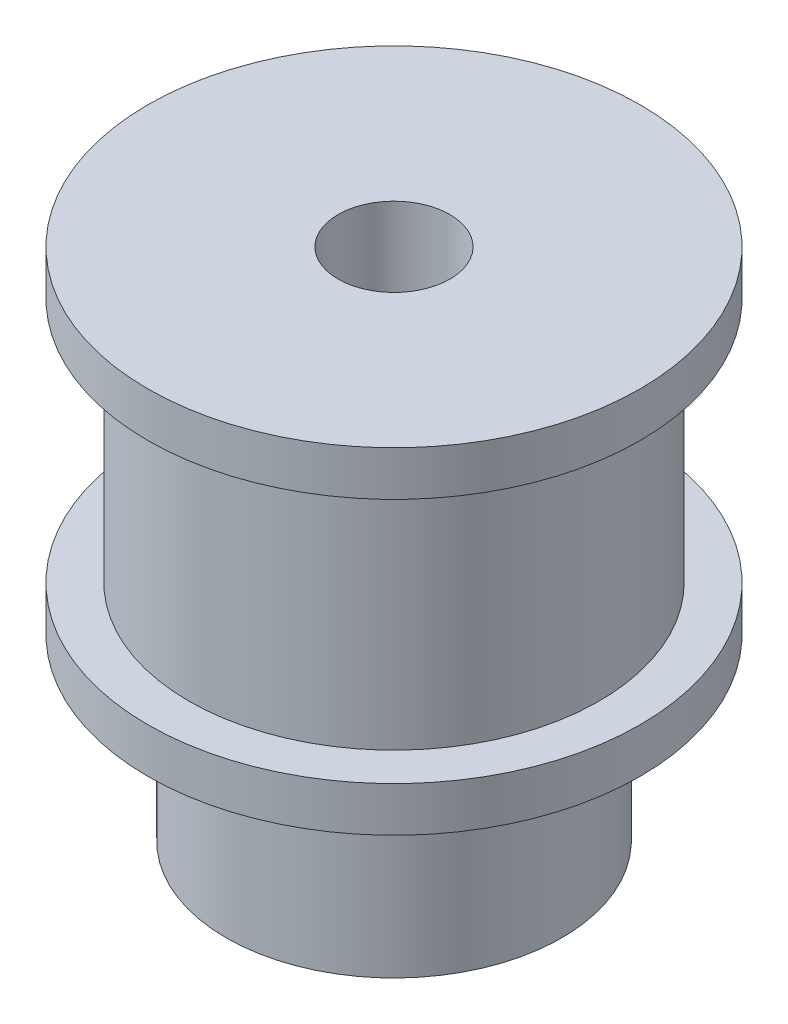
ISO-10303-21;
HEADER;
FILE_DESCRIPTION(('STEP AP214'),'2;1');
FILE_NAME('part.step','',(''),(''),'','','');
FILE_SCHEMA(('AUTOMOTIVE_DESIGN { 1 0 10303 214 1 1 1 1 }'));
ENDSEC;
DATA;
#1=APPLICATION_CONTEXT('core data for automotive mechanical design processes');
#2=APPLICATION_PROTOCOL_DEFINITION('international standard','automotive_design',2000,#1);
#3=PRODUCT_CONTEXT('',#1,'mechanical');
#4=PRODUCT('Part','Part','',(#3));
#5=PRODUCT_RELATED_PRODUCT_CATEGORY('part','',(#4));
#6=PRODUCT_DEFINITION_FORMATION('','',#4);
#7=PRODUCT_DEFINITION_CONTEXT('part definition',#1,'design');
#8=PRODUCT_DEFINITION('design','',#6,#7);
#9=PRODUCT_DEFINITION_SHAPE('','',#8);
#10=(LENGTH_UNIT() NAMED_UNIT(*) SI_UNIT(.MILLI.,.METRE.));
#11=(NAMED_UNIT(*) PLANE_ANGLE_UNIT() SI_UNIT($,.RADIAN.));
#12=(NAMED_UNIT(*) SI_UNIT($,.STERADIAN.) SOLID_ANGLE_UNIT());
#13=UNCERTAINTY_MEASURE_WITH_UNIT(LENGTH_MEASURE(1.E-05),#10,'distance_accuracy_value','');
#14=(GEOMETRIC_REPRESENTATION_CONTEXT(3) GLOBAL_UNCERTAINTY_ASSIGNED_CONTEXT((#13)) GLOBAL_UNIT_ASSIGNED_CONTEXT((#10,
#11,#12)) REPRESENTATION_CONTEXT('',''));
#15=CARTESIAN_POINT('',(0.,0.,0.));
#16=DIRECTION('',(0.,0.,1.));
#17=DIRECTION('',(1.,0.,0.));
#18=AXIS2_PLACEMENT_3D('',#15,#16,#17);
#19=CARTESIAN_POINT('',(0.,2.,0.));
#20=DIRECTION('',(0.,-1.,0.));
#21=DIRECTION('',(0.,0.,-1.));
#22=AXIS2_PLACEMENT_3D('',#19,#20,#21);
#23=CYLINDRICAL_SURFACE('',#22,11.);
#24=CARTESIAN_POINT('',(0.,2.,0.));
#25=DIRECTION('',(0.,1.,0.));
#26=DIRECTION('',(0.,0.,1.));
#27=AXIS2_PLACEMENT_3D('',#24,#25,#26);
#28=CIRCLE('',#27,11.);
#29=CARTESIAN_POINT('',(0.,2.,11.));
#30=VERTEX_POINT('',#29);
#31=EDGE_CURVE('E55',#30,#30,#28,.T.);
#32=ORIENTED_EDGE('',*,*,#31,.F.);
#33=EDGE_LOOP('',(#32));
#34=FACE_BOUND('',#33,.T.);
#35=CARTESIAN_POINT('',(0.,0.,0.));
#36=DIRECTION('',(0.,1.,0.));
#37=DIRECTION('',(0.,0.,1.));
#38=AXIS2_PLACEMENT_3D('',#35,#36,#37);
#39=CIRCLE('',#38,11.);
#40=CARTESIAN_POINT('',(0.,0.,11.));
#41=VERTEX_POINT('',#40);
#42=EDGE_CURVE('E44',#41,#41,#39,.T.);
#43=ORIENTED_EDGE('',*,*,#42,.T.);
#44=EDGE_LOOP('',(#43));
#45=FACE_BOUND('',#44,.T.);
#46=ADVANCED_FACE('F41',(#34,#45),#23,.T.);
#47=CARTESIAN_POINT('',(0.,2.,0.));
#48=DIRECTION('',(0.,1.,0.));
#49=DIRECTION('',(0.,0.,1.));
#50=AXIS2_PLACEMENT_3D('',#47,#48,#49);
#51=PLANE('',#50);
#52=CARTESIAN_POINT('',(0.,2.,0.));
#53=DIRECTION('',(0.,1.,0.));
#54=DIRECTION('',(0.,0.,1.));
#55=AXIS2_PLACEMENT_3D('',#52,#53,#54);
#56=CIRCLE('',#55,9.17);
#57=CARTESIAN_POINT('',(0.,2.,9.17));
#58=VERTEX_POINT('',#57);
#59=EDGE_CURVE('E49',#58,#58,#56,.T.);
#60=ORIENTED_EDGE('',*,*,#59,.F.);
#61=EDGE_LOOP('',(#60));
#62=FACE_BOUND('',#61,.T.);
#63=ORIENTED_EDGE('',*,*,#31,.T.);
#64=EDGE_LOOP('',(#63));
#65=FACE_BOUND('',#64,.T.);
#66=ADVANCED_FACE('F88',(#62,#65),#51,.T.);
#67=CARTESIAN_POINT('',(0.,0.,0.));
#68=DIRECTION('',(0.,1.,0.));
#69=DIRECTION('',(0.,0.,1.));
#70=AXIS2_PLACEMENT_3D('',#67,#68,#69);
#71=PLANE('',#70);
#72=CARTESIAN_POINT('',(0.,0.,0.));
#73=DIRECTION('',(0.,-1.,0.));
#74=DIRECTION('',(0.,0.,-1.));
#75=AXIS2_PLACEMENT_3D('',#72,#73,#74);
#76=CIRCLE('',#75,7.5);
#77=CARTESIAN_POINT('',(0.,0.,-7.5));
#78=VERTEX_POINT('',#77);
#79=EDGE_CURVE('E10',#78,#78,#76,.T.);
#80=ORIENTED_EDGE('',*,*,#79,.F.);
#81=EDGE_LOOP('',(#80));
#82=FACE_BOUND('',#81,.T.);
#83=ORIENTED_EDGE('',*,*,#42,.F.);
#84=EDGE_LOOP('',(#83));
#85=FACE_BOUND('',#84,.T.);
#86=ADVANCED_FACE('F85',(#82,#85),#71,.F.);
#87=CARTESIAN_POINT('',(0.,13.,0.));
#88=DIRECTION('',(0.,-1.,0.));
#89=DIRECTION('',(0.,0.,-1.));
#90=AXIS2_PLACEMENT_3D('',#87,#88,#89);
#91=CYLINDRICAL_SURFACE('',#90,9.17);
#92=CARTESIAN_POINT('',(0.,13.,0.));
#93=DIRECTION('',(0.,1.,0.));
#94=DIRECTION('',(0.,0.,1.));
#95=AXIS2_PLACEMENT_3D('',#92,#93,#94);
#96=CIRCLE('',#95,9.17);
#97=CARTESIAN_POINT('',(0.,13.,9.17));
#98=VERTEX_POINT('',#97);
#99=EDGE_CURVE('E70',#98,#98,#96,.T.);
#100=ORIENTED_EDGE('',*,*,#99,.F.);
#101=EDGE_LOOP('',(#100));
#102=FACE_BOUND('',#101,.T.);
#103=ORIENTED_EDGE('',*,*,#59,.T.);
#104=EDGE_LOOP('',(#103));
#105=FACE_BOUND('',#104,.T.);
#106=ADVANCED_FACE('F87',(#102,#105),#91,.T.);
#107=CARTESIAN_POINT('',(0.,15.,0.));
#108=DIRECTION('',(0.,-1.,0.));
#109=DIRECTION('',(0.,0.,-1.));
#110=AXIS2_PLACEMENT_3D('',#107,#108,#109);
#111=CYLINDRICAL_SURFACE('',#110,11.);
#112=CARTESIAN_POINT('',(0.,15.,0.));
#113=DIRECTION('',(0.,1.,0.));
#114=DIRECTION('',(0.,0.,1.));
#115=AXIS2_PLACEMENT_3D('',#112,#113,#114);
#116=CIRCLE('',#115,11.);
#117=CARTESIAN_POINT('',(0.,15.,11.));
#118=VERTEX_POINT('',#117);
#119=EDGE_CURVE('E66',#118,#118,#116,.T.);
#120=ORIENTED_EDGE('',*,*,#119,.F.);
#121=EDGE_LOOP('',(#120));
#122=FACE_BOUND('',#121,.T.);
#123=CARTESIAN_POINT('',(0.,13.,0.));
#124=DIRECTION('',(0.,1.,0.));
#125=DIRECTION('',(0.,0.,1.));
#126=AXIS2_PLACEMENT_3D('',#123,#124,#125);
#127=CIRCLE('',#126,11.);
#128=CARTESIAN_POINT('',(0.,13.,11.));
#129=VERTEX_POINT('',#128);
#130=EDGE_CURVE('E65',#129,#129,#127,.T.);
#131=ORIENTED_EDGE('',*,*,#130,.T.);
#132=EDGE_LOOP('',(#131));
#133=FACE_BOUND('',#132,.T.);
#134=ADVANCED_FACE('F94',(#122,#133),#111,.T.);
#135=CARTESIAN_POINT('',(0.,15.,0.));
#136=DIRECTION('',(0.,1.,0.));
#137=DIRECTION('',(0.,0.,1.));
#138=AXIS2_PLACEMENT_3D('',#135,#136,#137);
#139=PLANE('',#138);
#140=CARTESIAN_POINT('',(0.,15.,0.));
#141=DIRECTION('',(0.,1.,0.));
#142=DIRECTION('',(0.,0.,1.));
#143=AXIS2_PLACEMENT_3D('',#140,#141,#142);
#144=CIRCLE('',#143,2.5);
#145=CARTESIAN_POINT('',(0.,15.,2.5));
#146=VERTEX_POINT('',#145);
#147=EDGE_CURVE('E61',#146,#146,#144,.T.);
#148=ORIENTED_EDGE('',*,*,#147,.F.);
#149=EDGE_LOOP('',(#148));
#150=FACE_BOUND('',#149,.T.);
#151=ORIENTED_EDGE('',*,*,#119,.T.);
#152=EDGE_LOOP('',(#151));
#153=FACE_BOUND('',#152,.T.);
#154=ADVANCED_FACE('F125',(#150,#153),#139,.T.);
#155=CARTESIAN_POINT('',(0.,13.,0.));
#156=DIRECTION('',(0.,1.,0.));
#157=DIRECTION('',(0.,0.,1.));
#158=AXIS2_PLACEMENT_3D('',#155,#156,#157);
#159=PLANE('',#158);
#160=ORIENTED_EDGE('',*,*,#99,.T.);
#161=EDGE_LOOP('',(#160));
#162=FACE_BOUND('',#161,.T.);
#163=ORIENTED_EDGE('',*,*,#130,.F.);
#164=EDGE_LOOP('',(#163));
#165=FACE_BOUND('',#164,.T.);
#166=ADVANCED_FACE('F134',(#162,#165),#159,.F.);
#167=CARTESIAN_POINT('',(0.,-11.,0.));
#168=DIRECTION('',(0.,1.,0.));
#169=DIRECTION('',(0.,0.,1.));
#170=AXIS2_PLACEMENT_3D('',#167,#168,#169);
#171=CYLINDRICAL_SURFACE('',#170,2.5);
#172=CARTESIAN_POINT('',(0.,-8.,0.));
#173=DIRECTION('',(0.,-1.,0.));
#174=DIRECTION('',(0.,0.,-1.));
#175=AXIS2_PLACEMENT_3D('',#172,#173,#174);
#176=CIRCLE('',#175,2.5);
#177=CARTESIAN_POINT('',(0.,-8.,2.5));
#178=VERTEX_POINT('',#177);
#179=EDGE_CURVE('E208',#178,#178,#176,.T.);
#180=CARTESIAN_POINT('',(0.,15.,2.5));
#181=CARTESIAN_POINT('',(0.,14.7604166666667,2.5));
#182=CARTESIAN_POINT('',(0.,14.5208333333333,2.5));
#183=CARTESIAN_POINT('',(0.,14.0416666666667,2.5));
#184=CARTESIAN_POINT('',(0.,13.8020833333333,2.5));
#185=CARTESIAN_POINT('',(0.,13.3229166666667,2.5));
#186=CARTESIAN_POINT('',(0.,13.0833333333333,2.5));
#187=CARTESIAN_POINT('',(0.,12.6041666666667,2.5));
#188=CARTESIAN_POINT('',(0.,12.3645833333333,2.5));
#189=CARTESIAN_POINT('',(0.,11.8854166666667,2.5));
#190=CARTESIAN_POINT('',(0.,11.6458333333333,2.5));
#191=CARTESIAN_POINT('',(0.,11.1666666666667,2.5));
#192=CARTESIAN_POINT('',(0.,10.9270833333333,2.5));
#193=CARTESIAN_POINT('',(0.,10.4479166666667,2.5));
#194=CARTESIAN_POINT('',(0.,10.2083333333333,2.5));
#195=CARTESIAN_POINT('',(0.,9.72916666666667,2.5));
#196=CARTESIAN_POINT('',(0.,9.48958333333333,2.5));
#197=CARTESIAN_POINT('',(0.,9.01041666666667,2.5));
#198=CARTESIAN_POINT('',(0.,8.77083333333333,2.5));
#199=CARTESIAN_POINT('',(0.,8.29166666666667,2.5));
#200=CARTESIAN_POINT('',(0.,8.05208333333333,2.5));
#201=CARTESIAN_POINT('',(0.,7.57291666666667,2.5));
#202=CARTESIAN_POINT('',(0.,7.33333333333333,2.5));
#203=CARTESIAN_POINT('',(0.,6.85416666666667,2.5));
#204=CARTESIAN_POINT('',(0.,6.61458333333333,2.5));
#205=CARTESIAN_POINT('',(0.,6.13541666666667,2.5));
#206=CARTESIAN_POINT('',(0.,5.89583333333333,2.5));
#207=CARTESIAN_POINT('',(0.,5.41666666666667,2.5));
#208=CARTESIAN_POINT('',(0.,5.17708333333333,2.5));
#209=CARTESIAN_POINT('',(0.,4.69791666666667,2.5));
#210=CARTESIAN_POINT('',(0.,4.45833333333333,2.5));
#211=CARTESIAN_POINT('',(0.,3.97916666666667,2.5));
#212=CARTESIAN_POINT('',(0.,3.73958333333333,2.5));
#213=CARTESIAN_POINT('',(0.,3.26041666666667,2.5));
#214=CARTESIAN_POINT('',(0.,3.02083333333333,2.5));
#215=CARTESIAN_POINT('',(0.,2.54166666666667,2.5));
#216=CARTESIAN_POINT('',(0.,2.30208333333333,2.5));
#217=CARTESIAN_POINT('',(0.,1.82291666666667,2.5));
#218=CARTESIAN_POINT('',(0.,1.58333333333333,2.5));
#219=CARTESIAN_POINT('',(0.,1.10416666666667,2.5));
#220=CARTESIAN_POINT('',(0.,0.864583333333335,2.5));
#221=CARTESIAN_POINT('',(0.,0.385416666666669,2.5));
#222=CARTESIAN_POINT('',(0.,0.145833333333335,2.5));
#223=CARTESIAN_POINT('',(0.,-0.333333333333332,2.5));
#224=CARTESIAN_POINT('',(0.,-0.572916666666666,2.5));
#225=CARTESIAN_POINT('',(0.,-1.05208333333333,2.5));
#226=CARTESIAN_POINT('',(0.,-1.29166666666667,2.5));
#227=CARTESIAN_POINT('',(0.,-1.77083333333333,2.5));
#228=CARTESIAN_POINT('',(0.,-2.01041666666667,2.5));
#229=CARTESIAN_POINT('',(0.,-2.48958333333333,2.5));
#230=CARTESIAN_POINT('',(0.,-2.72916666666666,2.5));
#231=CARTESIAN_POINT('',(0.,-3.20833333333333,2.5));
#232=CARTESIAN_POINT('',(0.,-3.44791666666666,2.5));
#233=CARTESIAN_POINT('',(0.,-3.92708333333333,2.5));
#234=CARTESIAN_POINT('',(0.,-4.16666666666666,2.5));
#235=CARTESIAN_POINT('',(0.,-4.64583333333333,2.5));
#236=CARTESIAN_POINT('',(0.,-4.88541666666666,2.5));
#237=CARTESIAN_POINT('',(0.,-5.36458333333333,2.5));
#238=CARTESIAN_POINT('',(0.,-5.60416666666667,2.5));
#239=CARTESIAN_POINT('',(0.,-6.08333333333333,2.5));
#240=CARTESIAN_POINT('',(0.,-6.32291666666666,2.5));
#241=CARTESIAN_POINT('',(0.,-6.80208333333333,2.5));
#242=CARTESIAN_POINT('',(0.,-7.04166666666666,2.5));
#243=CARTESIAN_POINT('',(0.,-7.52083333333333,2.5));
#244=CARTESIAN_POINT('',(0.,-7.76041666666666,2.5));
#245=CARTESIAN_POINT('',(0.,-8.,2.5));
#246=B_SPLINE_CURVE_WITH_KNOTS('',3,(#180,#181,#182,#183,#184,#185,#186,#187,#188,#189,#190,
#191,#192,#193,#194,#195,#196,#197,#198,#199,#200,#201,#202,#203,#204,#205,#206,#207,#208,#209,
#210,#211,#212,#213,#214,#215,#216,#217,#218,#219,#220,#221,#222,#223,#224,#225,#226,#227,#228,
#229,#230,#231,#232,#233,#234,#235,#236,#237,#238,#239,#240,#241,#242,#243,#244,#245),
.UNSPECIFIED.,.F.,.F.,(4,2,2,2,2,2,2,2,2,2,2,2,2,2,2,2,2,2,2,2,2,2,2,2,2,2,2,2,2,2,2,2,4),(0.,
0.718750000000001,1.4375,2.15625,2.875,3.59375,4.3125,5.03125,5.75,6.46875,7.1875,7.90625,8.625,
9.34375,10.0625,10.78125,11.5,12.21875,12.9375,13.65625,14.375,15.09375,15.8125,16.53125,17.25,
17.96875,18.6875,19.40625,20.125,20.84375,21.5625,22.28125,23.),.UNSPECIFIED.);
#247=EDGE_CURVE('BSEAM139',#146,#178,#246,.T.);
#248=ORIENTED_EDGE('',*,*,#147,.T.);
#249=ORIENTED_EDGE('',*,*,#179,.T.);
#250=ORIENTED_EDGE('',*,*,#247,.T.);
#251=ORIENTED_EDGE('',*,*,#247,.F.);
#252=EDGE_LOOP('',(#248,#250,#249,#251));
#253=FACE_BOUND('',#252,.T.);
#254=ADVANCED_FACE('F139',(#253),#171,.F.);
#255=CARTESIAN_POINT('',(0.,-8.,0.));
#256=DIRECTION('',(0.,-1.,0.));
#257=DIRECTION('',(0.,0.,-1.));
#258=AXIS2_PLACEMENT_3D('',#255,#256,#257);
#259=PLANE('',#258);
#260=CARTESIAN_POINT('',(0.,-8.,0.));
#261=DIRECTION('',(0.,-1.,0.));
#262=DIRECTION('',(0.,0.,-1.));
#263=AXIS2_PLACEMENT_3D('',#260,#261,#262);
#264=CIRCLE('',#263,7.5);
#265=CARTESIAN_POINT('',(0.,-8.,-7.5));
#266=VERTEX_POINT('',#265);
#267=EDGE_CURVE('E59',#266,#266,#264,.T.);
#268=ORIENTED_EDGE('',*,*,#267,.T.);
#269=EDGE_LOOP('',(#268));
#270=FACE_BOUND('',#269,.T.);
#271=ORIENTED_EDGE('',*,*,#179,.F.);
#272=EDGE_LOOP('',(#271));
#273=FACE_BOUND('',#272,.T.);
#274=ADVANCED_FACE('F163',(#270,#273),#259,.T.);
#275=CARTESIAN_POINT('',(0.,-8.,0.));
#276=DIRECTION('',(0.,1.,0.));
#277=DIRECTION('',(0.,0.,1.));
#278=AXIS2_PLACEMENT_3D('',#275,#276,#277);
#279=CYLINDRICAL_SURFACE('',#278,7.5);
#280=ORIENTED_EDGE('',*,*,#267,.F.);
#281=EDGE_LOOP('',(#280));
#282=FACE_BOUND('',#281,.T.);
#283=ORIENTED_EDGE('',*,*,#79,.T.);
#284=EDGE_LOOP('',(#283));
#285=FACE_BOUND('',#284,.T.);
#286=ADVANCED_FACE('F173',(#282,#285),#279,.T.);
#287=CLOSED_SHELL('',(#46,#66,#86,#106,#134,#154,#166,#254,#274,#286));
#288=MANIFOLD_SOLID_BREP('B2',#287);
#289=ADVANCED_BREP_SHAPE_REPRESENTATION('',(#18,#288),#14);
#290=SHAPE_DEFINITION_REPRESENTATION(#9,#289);
ENDSEC;
END-ISO-10303-21;
